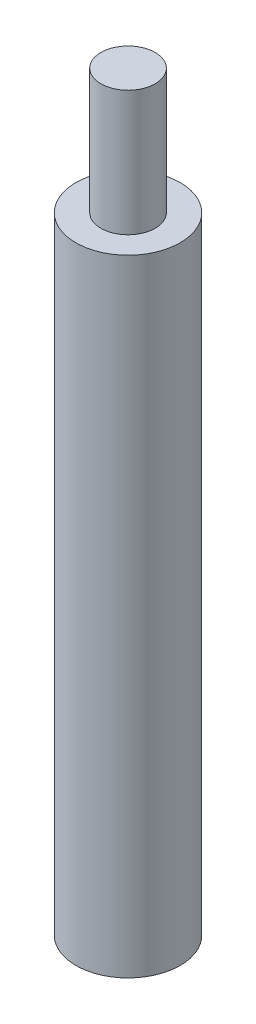
ISO-10303-21;
HEADER;
FILE_DESCRIPTION(('STEP AP214'),'2;1');
FILE_NAME('part.step','',(''),(''),'','','');
FILE_SCHEMA(('AUTOMOTIVE_DESIGN { 1 0 10303 214 1 1 1 1 }'));
ENDSEC;
DATA;
#1=APPLICATION_CONTEXT('core data for automotive mechanical design processes');
#2=APPLICATION_PROTOCOL_DEFINITION('international standard','automotive_design',2000,#1);
#3=PRODUCT_CONTEXT('',#1,'mechanical');
#4=PRODUCT('Part','Part','',(#3));
#5=PRODUCT_RELATED_PRODUCT_CATEGORY('part','',(#4));
#6=PRODUCT_DEFINITION_FORMATION('','',#4);
#7=PRODUCT_DEFINITION_CONTEXT('part definition',#1,'design');
#8=PRODUCT_DEFINITION('design','',#6,#7);
#9=PRODUCT_DEFINITION_SHAPE('','',#8);
#10=(LENGTH_UNIT() NAMED_UNIT(*) SI_UNIT(.MILLI.,.METRE.));
#11=(NAMED_UNIT(*) PLANE_ANGLE_UNIT() SI_UNIT($,.RADIAN.));
#12=(NAMED_UNIT(*) SI_UNIT($,.STERADIAN.) SOLID_ANGLE_UNIT());
#13=UNCERTAINTY_MEASURE_WITH_UNIT(LENGTH_MEASURE(1.E-05),#10,'distance_accuracy_value','');
#14=(GEOMETRIC_REPRESENTATION_CONTEXT(3) GLOBAL_UNCERTAINTY_ASSIGNED_CONTEXT((#13)) GLOBAL_UNIT_ASSIGNED_CONTEXT((#10,
#11,#12)) REPRESENTATION_CONTEXT('',''));
#15=CARTESIAN_POINT('',(0.,0.,0.));
#16=DIRECTION('',(0.,0.,1.));
#17=DIRECTION('',(1.,0.,0.));
#18=AXIS2_PLACEMENT_3D('',#15,#16,#17);
#19=CARTESIAN_POINT('',(0.,76.2,0.));
#20=DIRECTION('',(0.,-1.,0.));
#21=DIRECTION('',(0.,0.,-1.));
#22=AXIS2_PLACEMENT_3D('',#19,#20,#21);
#23=CYLINDRICAL_SURFACE('',#22,6.35);
#24=CARTESIAN_POINT('',(0.,76.2,0.));
#25=DIRECTION('',(0.,1.,0.));
#26=DIRECTION('',(0.,0.,1.));
#27=AXIS2_PLACEMENT_3D('',#24,#25,#26);
#28=CIRCLE('',#27,6.35);
#29=CARTESIAN_POINT('',(0.,76.2,-6.35));
#30=VERTEX_POINT('',#29);
#31=EDGE_CURVE('E43',#30,#30,#28,.T.);
#32=CARTESIAN_POINT('',(0.,0.,0.));
#33=DIRECTION('',(0.,1.,0.));
#34=DIRECTION('',(0.,0.,1.));
#35=AXIS2_PLACEMENT_3D('',#32,#33,#34);
#36=CIRCLE('',#35,6.35);
#37=CARTESIAN_POINT('',(0.,0.,-6.35));
#38=VERTEX_POINT('',#37);
#39=EDGE_CURVE('E38',#38,#38,#36,.T.);
#40=CARTESIAN_POINT('',(0.,76.2,-6.35));
#41=CARTESIAN_POINT('',(0.,75.40625,-6.35));
#42=CARTESIAN_POINT('',(0.,74.6125,-6.35));
#43=CARTESIAN_POINT('',(0.,73.025,-6.35));
#44=CARTESIAN_POINT('',(0.,72.23125,-6.35));
#45=CARTESIAN_POINT('',(0.,70.64375,-6.35));
#46=CARTESIAN_POINT('',(0.,69.85,-6.35));
#47=CARTESIAN_POINT('',(0.,68.2625,-6.35));
#48=CARTESIAN_POINT('',(0.,67.46875,-6.35));
#49=CARTESIAN_POINT('',(0.,65.88125,-6.35));
#50=CARTESIAN_POINT('',(0.,65.0875,-6.35));
#51=CARTESIAN_POINT('',(0.,63.5,-6.35));
#52=CARTESIAN_POINT('',(0.,62.70625,-6.35));
#53=CARTESIAN_POINT('',(0.,61.11875,-6.35));
#54=CARTESIAN_POINT('',(0.,60.325,-6.35));
#55=CARTESIAN_POINT('',(0.,58.7375,-6.35));
#56=CARTESIAN_POINT('',(0.,57.94375,-6.35));
#57=CARTESIAN_POINT('',(0.,56.35625,-6.35));
#58=CARTESIAN_POINT('',(0.,55.5625,-6.35));
#59=CARTESIAN_POINT('',(0.,53.975,-6.35));
#60=CARTESIAN_POINT('',(0.,53.18125,-6.35));
#61=CARTESIAN_POINT('',(0.,51.59375,-6.35));
#62=CARTESIAN_POINT('',(0.,50.8,-6.35));
#63=CARTESIAN_POINT('',(0.,49.2125,-6.35));
#64=CARTESIAN_POINT('',(0.,48.41875,-6.35));
#65=CARTESIAN_POINT('',(0.,46.83125,-6.35));
#66=CARTESIAN_POINT('',(0.,46.0375,-6.35));
#67=CARTESIAN_POINT('',(0.,44.45,-6.35));
#68=CARTESIAN_POINT('',(0.,43.65625,-6.35));
#69=CARTESIAN_POINT('',(0.,42.06875,-6.35));
#70=CARTESIAN_POINT('',(0.,41.275,-6.35));
#71=CARTESIAN_POINT('',(0.,39.6875,-6.35));
#72=CARTESIAN_POINT('',(0.,38.89375,-6.35));
#73=CARTESIAN_POINT('',(0.,37.30625,-6.35));
#74=CARTESIAN_POINT('',(0.,36.5125,-6.35));
#75=CARTESIAN_POINT('',(0.,34.925,-6.35));
#76=CARTESIAN_POINT('',(0.,34.13125,-6.35));
#77=CARTESIAN_POINT('',(0.,32.54375,-6.35));
#78=CARTESIAN_POINT('',(0.,31.75,-6.35));
#79=CARTESIAN_POINT('',(0.,30.1625,-6.35));
#80=CARTESIAN_POINT('',(0.,29.36875,-6.35));
#81=CARTESIAN_POINT('',(0.,27.78125,-6.35));
#82=CARTESIAN_POINT('',(0.,26.9875,-6.35));
#83=CARTESIAN_POINT('',(0.,25.4,-6.35));
#84=CARTESIAN_POINT('',(0.,24.60625,-6.35));
#85=CARTESIAN_POINT('',(0.,23.01875,-6.35));
#86=CARTESIAN_POINT('',(0.,22.225,-6.35));
#87=CARTESIAN_POINT('',(0.,20.6375,-6.35));
#88=CARTESIAN_POINT('',(0.,19.84375,-6.35));
#89=CARTESIAN_POINT('',(0.,18.25625,-6.35));
#90=CARTESIAN_POINT('',(0.,17.4625,-6.35));
#91=CARTESIAN_POINT('',(0.,15.875,-6.35));
#92=CARTESIAN_POINT('',(0.,15.08125,-6.35));
#93=CARTESIAN_POINT('',(0.,13.49375,-6.35));
#94=CARTESIAN_POINT('',(0.,12.7,-6.35));
#95=CARTESIAN_POINT('',(0.,11.1125,-6.35));
#96=CARTESIAN_POINT('',(0.,10.31875,-6.35));
#97=CARTESIAN_POINT('',(0.,8.73125,-6.35));
#98=CARTESIAN_POINT('',(0.,7.93750000000001,-6.35));
#99=CARTESIAN_POINT('',(0.,6.35,-6.35));
#100=CARTESIAN_POINT('',(0.,5.55625,-6.35));
#101=CARTESIAN_POINT('',(0.,3.96875,-6.35));
#102=CARTESIAN_POINT('',(0.,3.175,-6.35));
#103=CARTESIAN_POINT('',(0.,1.5875,-6.35));
#104=CARTESIAN_POINT('',(0.,0.793750000000001,-6.35));
#105=CARTESIAN_POINT('',(0.,0.,-6.35));
#106=B_SPLINE_CURVE_WITH_KNOTS('',3,(#40,#41,#42,#43,#44,#45,#46,#47,#48,#49,#50,#51,#52,#53,
#54,#55,#56,#57,#58,#59,#60,#61,#62,#63,#64,#65,#66,#67,#68,#69,#70,#71,#72,#73,#74,#75,#76,#77,
#78,#79,#80,#81,#82,#83,#84,#85,#86,#87,#88,#89,#90,#91,#92,#93,#94,#95,#96,#97,#98,#99,#100,
#101,#102,#103,#104,#105),.UNSPECIFIED.,.F.,.F.,(4,2,2,2,2,2,2,2,2,2,2,2,2,2,2,2,2,2,2,2,2,2,2,
2,2,2,2,2,2,2,2,2,4),(0.,2.38124999999999,4.76249999999999,7.14374999999999,9.52499999999999,
11.90625,14.2875,16.66875,19.05,21.43125,23.8125,26.19375,28.575,30.95625,33.3375,35.71875,38.1,
40.48125,42.8625,45.24375,47.625,50.00625,52.3875,54.76875,57.15,59.53125,61.9125,64.29375,
66.675,69.05625,71.4375,73.81875,76.2),.UNSPECIFIED.);
#107=EDGE_CURVE('BSEAM35',#30,#38,#106,.T.);
#108=ORIENTED_EDGE('',*,*,#31,.F.);
#109=ORIENTED_EDGE('',*,*,#39,.T.);
#110=ORIENTED_EDGE('',*,*,#107,.T.);
#111=ORIENTED_EDGE('',*,*,#107,.F.);
#112=EDGE_LOOP('',(#108,#110,#109,#111));
#113=FACE_BOUND('',#112,.T.);
#114=ADVANCED_FACE('F35',(#113),#23,.T.);
#115=CARTESIAN_POINT('',(0.,76.2,0.));
#116=DIRECTION('',(0.,1.,0.));
#117=DIRECTION('',(0.,0.,1.));
#118=AXIS2_PLACEMENT_3D('',#115,#116,#117);
#119=PLANE('',#118);
#120=CARTESIAN_POINT('',(0.,76.2,0.));
#121=DIRECTION('',(0.,1.,0.));
#122=DIRECTION('',(0.,0.,1.));
#123=AXIS2_PLACEMENT_3D('',#120,#121,#122);
#124=CIRCLE('',#123,3.302);
#125=CARTESIAN_POINT('',(0.,76.2,-3.302));
#126=VERTEX_POINT('',#125);
#127=EDGE_CURVE('E10',#126,#126,#124,.T.);
#128=ORIENTED_EDGE('',*,*,#127,.F.);
#129=EDGE_LOOP('',(#128));
#130=FACE_BOUND('',#129,.T.);
#131=ORIENTED_EDGE('',*,*,#31,.T.);
#132=EDGE_LOOP('',(#131));
#133=FACE_BOUND('',#132,.T.);
#134=ADVANCED_FACE('F63',(#130,#133),#119,.T.);
#135=CARTESIAN_POINT('',(0.,0.,0.));
#136=DIRECTION('',(0.,1.,0.));
#137=DIRECTION('',(0.,0.,1.));
#138=AXIS2_PLACEMENT_3D('',#135,#136,#137);
#139=PLANE('',#138);
#140=ORIENTED_EDGE('',*,*,#39,.F.);
#141=EDGE_LOOP('',(#140));
#142=FACE_BOUND('',#141,.T.);
#143=ADVANCED_FACE('F60',(#142),#139,.F.);
#144=CARTESIAN_POINT('',(0.,91.44,0.));
#145=DIRECTION('',(0.,-1.,0.));
#146=DIRECTION('',(0.,0.,-1.));
#147=AXIS2_PLACEMENT_3D('',#144,#145,#146);
#148=CYLINDRICAL_SURFACE('',#147,3.302);
#149=CARTESIAN_POINT('',(0.,91.44,0.));
#150=DIRECTION('',(0.,1.,0.));
#151=DIRECTION('',(0.,0.,1.));
#152=AXIS2_PLACEMENT_3D('',#149,#150,#151);
#153=CIRCLE('',#152,3.302);
#154=CARTESIAN_POINT('',(0.,91.44,-3.302));
#155=VERTEX_POINT('',#154);
#156=EDGE_CURVE('E51',#155,#155,#153,.T.);
#157=CARTESIAN_POINT('',(0.,91.44,-3.302));
#158=CARTESIAN_POINT('',(0.,91.28125,-3.302));
#159=CARTESIAN_POINT('',(0.,91.1225,-3.302));
#160=CARTESIAN_POINT('',(0.,90.805,-3.302));
#161=CARTESIAN_POINT('',(0.,90.64625,-3.302));
#162=CARTESIAN_POINT('',(0.,90.32875,-3.302));
#163=CARTESIAN_POINT('',(0.,90.17,-3.302));
#164=CARTESIAN_POINT('',(0.,89.8525,-3.302));
#165=CARTESIAN_POINT('',(0.,89.69375,-3.302));
#166=CARTESIAN_POINT('',(0.,89.37625,-3.302));
#167=CARTESIAN_POINT('',(0.,89.2175,-3.302));
#168=CARTESIAN_POINT('',(0.,88.9,-3.302));
#169=CARTESIAN_POINT('',(0.,88.74125,-3.302));
#170=CARTESIAN_POINT('',(0.,88.42375,-3.302));
#171=CARTESIAN_POINT('',(0.,88.265,-3.302));
#172=CARTESIAN_POINT('',(0.,87.9475,-3.302));
#173=CARTESIAN_POINT('',(0.,87.78875,-3.302));
#174=CARTESIAN_POINT('',(0.,87.47125,-3.302));
#175=CARTESIAN_POINT('',(0.,87.3125,-3.302));
#176=CARTESIAN_POINT('',(0.,86.995,-3.302));
#177=CARTESIAN_POINT('',(0.,86.83625,-3.302));
#178=CARTESIAN_POINT('',(0.,86.51875,-3.302));
#179=CARTESIAN_POINT('',(0.,86.36,-3.302));
#180=CARTESIAN_POINT('',(0.,86.0425,-3.302));
#181=CARTESIAN_POINT('',(0.,85.88375,-3.302));
#182=CARTESIAN_POINT('',(0.,85.56625,-3.302));
#183=CARTESIAN_POINT('',(0.,85.4075,-3.302));
#184=CARTESIAN_POINT('',(0.,85.09,-3.302));
#185=CARTESIAN_POINT('',(0.,84.93125,-3.302));
#186=CARTESIAN_POINT('',(0.,84.61375,-3.302));
#187=CARTESIAN_POINT('',(0.,84.455,-3.302));
#188=CARTESIAN_POINT('',(0.,84.1375,-3.302));
#189=CARTESIAN_POINT('',(0.,83.97875,-3.302));
#190=CARTESIAN_POINT('',(0.,83.66125,-3.302));
#191=CARTESIAN_POINT('',(0.,83.5025,-3.302));
#192=CARTESIAN_POINT('',(0.,83.185,-3.302));
#193=CARTESIAN_POINT('',(0.,83.02625,-3.302));
#194=CARTESIAN_POINT('',(0.,82.70875,-3.302));
#195=CARTESIAN_POINT('',(0.,82.55,-3.302));
#196=CARTESIAN_POINT('',(0.,82.2325,-3.302));
#197=CARTESIAN_POINT('',(0.,82.07375,-3.302));
#198=CARTESIAN_POINT('',(0.,81.75625,-3.302));
#199=CARTESIAN_POINT('',(0.,81.5975,-3.302));
#200=CARTESIAN_POINT('',(0.,81.28,-3.302));
#201=CARTESIAN_POINT('',(0.,81.12125,-3.302));
#202=CARTESIAN_POINT('',(0.,80.80375,-3.302));
#203=CARTESIAN_POINT('',(0.,80.645,-3.302));
#204=CARTESIAN_POINT('',(0.,80.3275,-3.302));
#205=CARTESIAN_POINT('',(0.,80.16875,-3.302));
#206=CARTESIAN_POINT('',(0.,79.85125,-3.302));
#207=CARTESIAN_POINT('',(0.,79.6925,-3.302));
#208=CARTESIAN_POINT('',(0.,79.375,-3.302));
#209=CARTESIAN_POINT('',(0.,79.21625,-3.302));
#210=CARTESIAN_POINT('',(0.,78.89875,-3.302));
#211=CARTESIAN_POINT('',(0.,78.74,-3.302));
#212=CARTESIAN_POINT('',(0.,78.4225,-3.302));
#213=CARTESIAN_POINT('',(0.,78.26375,-3.302));
#214=CARTESIAN_POINT('',(0.,77.94625,-3.302));
#215=CARTESIAN_POINT('',(0.,77.7875,-3.302));
#216=CARTESIAN_POINT('',(0.,77.47,-3.302));
#217=CARTESIAN_POINT('',(0.,77.31125,-3.302));
#218=CARTESIAN_POINT('',(0.,76.99375,-3.302));
#219=CARTESIAN_POINT('',(0.,76.835,-3.302));
#220=CARTESIAN_POINT('',(0.,76.5175,-3.302));
#221=CARTESIAN_POINT('',(0.,76.35875,-3.302));
#222=CARTESIAN_POINT('',(0.,76.2,-3.302));
#223=B_SPLINE_CURVE_WITH_KNOTS('',3,(#157,#158,#159,#160,#161,#162,#163,#164,#165,#166,#167,
#168,#169,#170,#171,#172,#173,#174,#175,#176,#177,#178,#179,#180,#181,#182,#183,#184,#185,#186,
#187,#188,#189,#190,#191,#192,#193,#194,#195,#196,#197,#198,#199,#200,#201,#202,#203,#204,#205,
#206,#207,#208,#209,#210,#211,#212,#213,#214,#215,#216,#217,#218,#219,#220,#221,#222),
.UNSPECIFIED.,.F.,.F.,(4,2,2,2,2,2,2,2,2,2,2,2,2,2,2,2,2,2,2,2,2,2,2,2,2,2,2,2,2,2,2,2,4),(0.,
0.476249999999998,0.952499999999995,1.42874999999999,1.90499999999999,2.38124999999999,2.8575,
3.33375,3.80999999999999,4.28624999999999,4.76249999999999,5.23874999999999,5.715,6.19125,
6.66749999999999,7.14374999999999,7.61999999999999,8.09625,8.5725,9.04874999999999,
9.52499999999999,10.00125,10.4775,10.95375,11.43,11.90625,12.3825,12.85875,13.335,13.81125,
14.2875,14.76375,15.24),.UNSPECIFIED.);
#224=EDGE_CURVE('BSEAM62',#155,#126,#223,.T.);
#225=ORIENTED_EDGE('',*,*,#156,.F.);
#226=ORIENTED_EDGE('',*,*,#127,.T.);
#227=ORIENTED_EDGE('',*,*,#224,.T.);
#228=ORIENTED_EDGE('',*,*,#224,.F.);
#229=EDGE_LOOP('',(#225,#227,#226,#228));
#230=FACE_BOUND('',#229,.T.);
#231=ADVANCED_FACE('F62',(#230),#148,.T.);
#232=CARTESIAN_POINT('',(0.,91.44,0.));
#233=DIRECTION('',(0.,1.,0.));
#234=DIRECTION('',(0.,0.,1.));
#235=AXIS2_PLACEMENT_3D('',#232,#233,#234);
#236=PLANE('',#235);
#237=ORIENTED_EDGE('',*,*,#156,.T.);
#238=EDGE_LOOP('',(#237));
#239=FACE_BOUND('',#238,.T.);
#240=ADVANCED_FACE('F68',(#239),#236,.T.);
#241=CLOSED_SHELL('',(#114,#134,#143,#231,#240));
#242=MANIFOLD_SOLID_BREP('B2',#241);
#243=ADVANCED_BREP_SHAPE_REPRESENTATION('',(#18,#242),#14);
#244=SHAPE_DEFINITION_REPRESENTATION(#9,#243);
ENDSEC;
END-ISO-10303-21;
